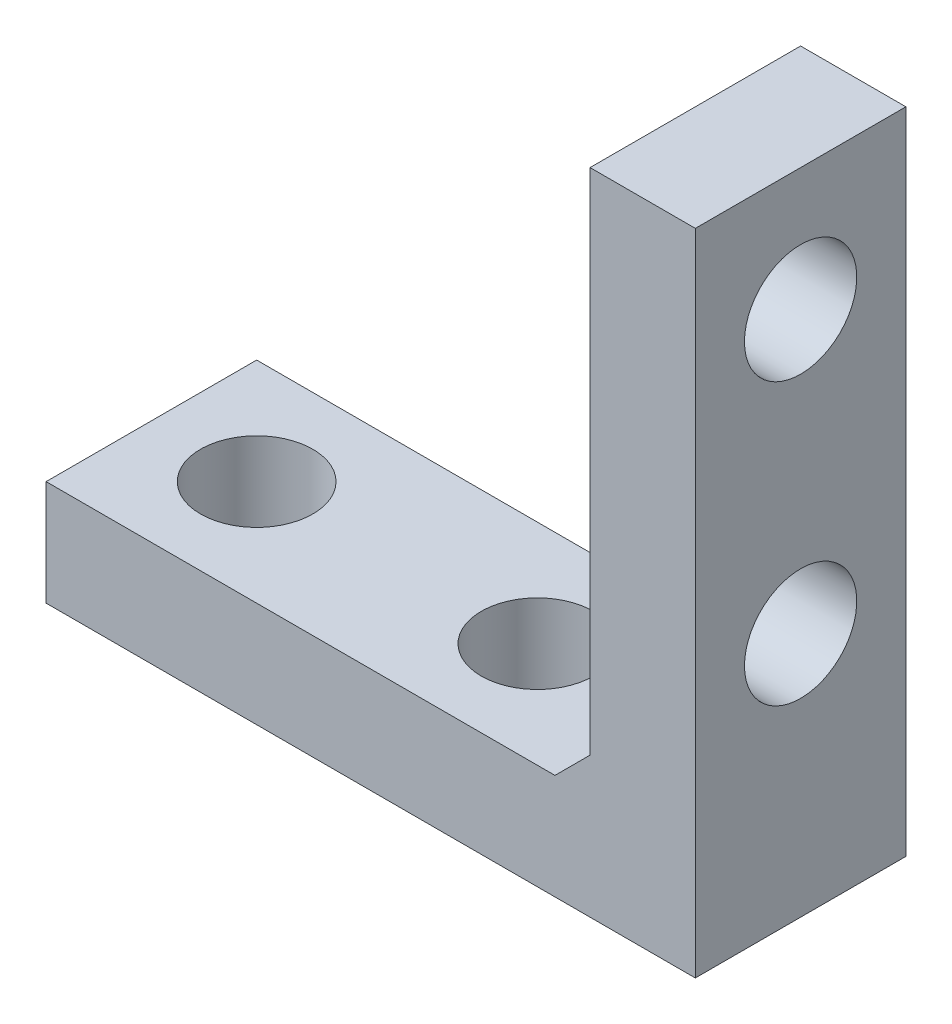
ISO-10303-21;
HEADER;
FILE_DESCRIPTION(('STEP AP214'),'2;1');
FILE_NAME('part.step','',(''),(''),'','','');
FILE_SCHEMA(('AUTOMOTIVE_DESIGN { 1 0 10303 214 1 1 1 1 }'));
ENDSEC;
DATA;
#1=APPLICATION_CONTEXT('core data for automotive mechanical design processes');
#2=APPLICATION_PROTOCOL_DEFINITION('international standard','automotive_design',2000,#1);
#3=PRODUCT_CONTEXT('',#1,'mechanical');
#4=PRODUCT('Part','Part','',(#3));
#5=PRODUCT_RELATED_PRODUCT_CATEGORY('part','',(#4));
#6=PRODUCT_DEFINITION_FORMATION('','',#4);
#7=PRODUCT_DEFINITION_CONTEXT('part definition',#1,'design');
#8=PRODUCT_DEFINITION('design','',#6,#7);
#9=PRODUCT_DEFINITION_SHAPE('','',#8);
#10=(LENGTH_UNIT() NAMED_UNIT(*) SI_UNIT(.MILLI.,.METRE.));
#11=(NAMED_UNIT(*) PLANE_ANGLE_UNIT() SI_UNIT($,.RADIAN.));
#12=(NAMED_UNIT(*) SI_UNIT($,.STERADIAN.) SOLID_ANGLE_UNIT());
#13=UNCERTAINTY_MEASURE_WITH_UNIT(LENGTH_MEASURE(1.E-05),#10,'distance_accuracy_value','');
#14=(GEOMETRIC_REPRESENTATION_CONTEXT(3) GLOBAL_UNCERTAINTY_ASSIGNED_CONTEXT((#13)) GLOBAL_UNIT_ASSIGNED_CONTEXT((#10,
#11,#12)) REPRESENTATION_CONTEXT('',''));
#15=CARTESIAN_POINT('',(0.,0.,0.));
#16=DIRECTION('',(0.,0.,1.));
#17=DIRECTION('',(1.,0.,0.));
#18=AXIS2_PLACEMENT_3D('',#15,#16,#17);
#19=CARTESIAN_POINT('',(0.,3.,0.));
#20=DIRECTION('',(0.,-1.,0.));
#21=DIRECTION('',(0.,0.,-1.));
#22=AXIS2_PLACEMENT_3D('',#19,#20,#21);
#23=PLANE('',#22);
#24=CARTESIAN_POINT('',(1.75,3.,0.));
#25=DIRECTION('',(0.,1.,0.));
#26=DIRECTION('',(0.,0.,1.));
#27=AXIS2_PLACEMENT_3D('',#24,#25,#26);
#28=CIRCLE('',#27,1.6);
#29=CARTESIAN_POINT('',(1.75,3.,1.6));
#30=VERTEX_POINT('',#29);
#31=EDGE_CURVE('E137',#30,#30,#28,.T.);
#32=ORIENTED_EDGE('',*,*,#31,.F.);
#33=EDGE_LOOP('',(#32));
#34=FACE_BOUND('',#33,.T.);
#35=CARTESIAN_POINT('',(-6.25,3.,0.));
#36=DIRECTION('',(0.,1.,0.));
#37=DIRECTION('',(0.,0.,1.));
#38=AXIS2_PLACEMENT_3D('',#35,#36,#37);
#39=CIRCLE('',#38,1.6);
#40=CARTESIAN_POINT('',(-6.25,3.,1.6));
#41=VERTEX_POINT('',#40);
#42=EDGE_CURVE('E99',#41,#41,#39,.T.);
#43=ORIENTED_EDGE('',*,*,#42,.F.);
#44=EDGE_LOOP('',(#43));
#45=FACE_BOUND('',#44,.T.);
#46=DIRECTION('',(1.,0.,0.));
#47=VECTOR('',#46,1.);
#48=CARTESIAN_POINT('',(-9.25,3.,3.));
#49=LINE('',#48,#47);
#50=CARTESIAN_POINT('',(-9.25,3.,3.));
#51=VERTEX_POINT('',#50);
#52=CARTESIAN_POINT('',(5.25,3.,3.));
#53=VERTEX_POINT('',#52);
#54=EDGE_CURVE('E94',#51,#53,#49,.T.);
#55=ORIENTED_EDGE('',*,*,#54,.T.);
#56=DIRECTION('',(0.,0.,1.));
#57=VECTOR('',#56,1.);
#58=CARTESIAN_POINT('',(5.25,3.,-3.));
#59=LINE('',#58,#57);
#60=CARTESIAN_POINT('',(5.25,3.,-3.));
#61=VERTEX_POINT('',#60);
#62=EDGE_CURVE('E147',#61,#53,#59,.T.);
#63=ORIENTED_EDGE('',*,*,#62,.F.);
#64=DIRECTION('',(-1.,0.,0.));
#65=VECTOR('',#64,1.);
#66=CARTESIAN_POINT('',(-9.25,3.,-3.));
#67=LINE('',#66,#65);
#68=CARTESIAN_POINT('',(-9.25,3.,-3.));
#69=VERTEX_POINT('',#68);
#70=EDGE_CURVE('E85',#61,#69,#67,.T.);
#71=ORIENTED_EDGE('',*,*,#70,.T.);
#72=DIRECTION('',(0.,0.,1.));
#73=VECTOR('',#72,1.);
#74=CARTESIAN_POINT('',(-9.25,3.,3.));
#75=LINE('',#74,#73);
#76=EDGE_CURVE('E52',#69,#51,#75,.T.);
#77=ORIENTED_EDGE('',*,*,#76,.T.);
#78=EDGE_LOOP('',(#55,#63,#71,#77));
#79=FACE_BOUND('',#78,.T.);
#80=ADVANCED_FACE('F35',(#34,#45,#79),#23,.F.);
#81=CARTESIAN_POINT('',(0.,0.,0.));
#82=DIRECTION('',(0.,-1.,0.));
#83=DIRECTION('',(0.,0.,-1.));
#84=AXIS2_PLACEMENT_3D('',#81,#82,#83);
#85=PLANE('',#84);
#86=CARTESIAN_POINT('',(-6.25,0.,0.));
#87=DIRECTION('',(0.,1.,0.));
#88=DIRECTION('',(0.,0.,1.));
#89=AXIS2_PLACEMENT_3D('',#86,#87,#88);
#90=CIRCLE('',#89,1.6);
#91=CARTESIAN_POINT('',(-6.25,0.,1.6));
#92=VERTEX_POINT('',#91);
#93=EDGE_CURVE('E103',#92,#92,#90,.T.);
#94=ORIENTED_EDGE('',*,*,#93,.T.);
#95=EDGE_LOOP('',(#94));
#96=FACE_BOUND('',#95,.T.);
#97=DIRECTION('',(0.,0.,-1.));
#98=VECTOR('',#97,1.);
#99=CARTESIAN_POINT('',(9.25,0.,3.));
#100=LINE('',#99,#98);
#101=CARTESIAN_POINT('',(9.25,0.,3.));
#102=VERTEX_POINT('',#101);
#103=CARTESIAN_POINT('',(9.25,0.,-3.));
#104=VERTEX_POINT('',#103);
#105=EDGE_CURVE('E91',#102,#104,#100,.T.);
#106=ORIENTED_EDGE('',*,*,#105,.F.);
#107=DIRECTION('',(1.,0.,0.));
#108=VECTOR('',#107,1.);
#109=CARTESIAN_POINT('',(-9.25,0.,3.));
#110=LINE('',#109,#108);
#111=CARTESIAN_POINT('',(-9.25,0.,3.));
#112=VERTEX_POINT('',#111);
#113=EDGE_CURVE('E74',#112,#102,#110,.T.);
#114=ORIENTED_EDGE('',*,*,#113,.F.);
#115=DIRECTION('',(0.,0.,1.));
#116=VECTOR('',#115,1.);
#117=CARTESIAN_POINT('',(-9.25,0.,3.));
#118=LINE('',#117,#116);
#119=CARTESIAN_POINT('',(-9.25,0.,-3.));
#120=VERTEX_POINT('',#119);
#121=EDGE_CURVE('E68',#120,#112,#118,.T.);
#122=ORIENTED_EDGE('',*,*,#121,.F.);
#123=DIRECTION('',(-1.,0.,0.));
#124=VECTOR('',#123,1.);
#125=CARTESIAN_POINT('',(-9.25,0.,-3.));
#126=LINE('',#125,#124);
#127=EDGE_CURVE('E98',#104,#120,#126,.T.);
#128=ORIENTED_EDGE('',*,*,#127,.F.);
#129=EDGE_LOOP('',(#106,#114,#122,#128));
#130=FACE_BOUND('',#129,.T.);
#131=CARTESIAN_POINT('',(1.75,0.,0.));
#132=DIRECTION('',(0.,1.,0.));
#133=DIRECTION('',(0.,0.,1.));
#134=AXIS2_PLACEMENT_3D('',#131,#132,#133);
#135=CIRCLE('',#134,1.6);
#136=CARTESIAN_POINT('',(1.75,0.,1.6));
#137=VERTEX_POINT('',#136);
#138=EDGE_CURVE('E136',#137,#137,#135,.T.);
#139=ORIENTED_EDGE('',*,*,#138,.T.);
#140=EDGE_LOOP('',(#139));
#141=FACE_BOUND('',#140,.T.);
#142=ADVANCED_FACE('F96',(#96,#130,#141),#85,.T.);
#143=CARTESIAN_POINT('',(9.25,3.,3.));
#144=DIRECTION('',(-1.,0.,0.));
#145=DIRECTION('',(0.,0.,1.));
#146=AXIS2_PLACEMENT_3D('',#143,#144,#145);
#147=PLANE('',#146);
#148=CARTESIAN_POINT('',(9.25,7.,0.));
#149=DIRECTION('',(-1.,0.,0.));
#150=DIRECTION('',(0.,0.,1.));
#151=AXIS2_PLACEMENT_3D('',#148,#149,#150);
#152=CIRCLE('',#151,1.6);
#153=CARTESIAN_POINT('',(9.25,7.,1.6));
#154=VERTEX_POINT('',#153);
#155=EDGE_CURVE('E167',#154,#154,#152,.T.);
#156=ORIENTED_EDGE('',*,*,#155,.T.);
#157=EDGE_LOOP('',(#156));
#158=FACE_BOUND('',#157,.T.);
#159=CARTESIAN_POINT('',(9.25,15.,0.));
#160=DIRECTION('',(-1.,0.,0.));
#161=DIRECTION('',(0.,0.,1.));
#162=AXIS2_PLACEMENT_3D('',#159,#160,#161);
#163=CIRCLE('',#162,1.6);
#164=CARTESIAN_POINT('',(9.25,15.,1.59999999999997));
#165=VERTEX_POINT('',#164);
#166=EDGE_CURVE('E173',#165,#165,#163,.T.);
#167=ORIENTED_EDGE('',*,*,#166,.T.);
#168=EDGE_LOOP('',(#167));
#169=FACE_BOUND('',#168,.T.);
#170=ORIENTED_EDGE('',*,*,#105,.T.);
#171=DIRECTION('',(0.,-1.,0.));
#172=VECTOR('',#171,1.);
#173=CARTESIAN_POINT('',(9.25,3.,-3.));
#174=LINE('',#173,#172);
#175=CARTESIAN_POINT('',(9.25,18.5,-3.));
#176=VERTEX_POINT('',#175);
#177=EDGE_CURVE('E11',#176,#104,#174,.T.);
#178=ORIENTED_EDGE('',*,*,#177,.F.);
#179=DIRECTION('',(0.,0.,-1.));
#180=VECTOR('',#179,1.);
#181=CARTESIAN_POINT('',(9.25,18.5,-3.));
#182=LINE('',#181,#180);
#183=CARTESIAN_POINT('',(9.25,18.5,3.));
#184=VERTEX_POINT('',#183);
#185=EDGE_CURVE('E93',#184,#176,#182,.T.);
#186=ORIENTED_EDGE('',*,*,#185,.F.);
#187=DIRECTION('',(0.,-1.,0.));
#188=VECTOR('',#187,1.);
#189=CARTESIAN_POINT('',(9.25,3.,3.));
#190=LINE('',#189,#188);
#191=EDGE_CURVE('E79',#184,#102,#190,.T.);
#192=ORIENTED_EDGE('',*,*,#191,.T.);
#193=EDGE_LOOP('',(#170,#178,#186,#192));
#194=FACE_BOUND('',#193,.T.);
#195=ADVANCED_FACE('F37',(#158,#169,#194),#147,.F.);
#196=CARTESIAN_POINT('',(-9.25,3.,-3.));
#197=DIRECTION('',(0.,0.,1.));
#198=DIRECTION('',(1.,0.,0.));
#199=AXIS2_PLACEMENT_3D('',#196,#197,#198);
#200=PLANE('',#199);
#201=ORIENTED_EDGE('',*,*,#70,.F.);
#202=DIRECTION('',(-0.707106781186547,-0.707106781186548,0.));
#203=VECTOR('',#202,1.);
#204=CARTESIAN_POINT('',(5.25,3.,-3.));
#205=LINE('',#204,#203);
#206=CARTESIAN_POINT('',(6.25,4.,-3.));
#207=VERTEX_POINT('',#206);
#208=EDGE_CURVE('E158',#207,#61,#205,.T.);
#209=ORIENTED_EDGE('',*,*,#208,.F.);
#210=DIRECTION('',(0.,-1.,0.));
#211=VECTOR('',#210,1.);
#212=CARTESIAN_POINT('',(6.25,18.5,-3.));
#213=LINE('',#212,#211);
#214=CARTESIAN_POINT('',(6.25,18.5,-3.));
#215=VERTEX_POINT('',#214);
#216=EDGE_CURVE('E128',#215,#207,#213,.T.);
#217=ORIENTED_EDGE('',*,*,#216,.F.);
#218=DIRECTION('',(-1.,0.,0.));
#219=VECTOR('',#218,1.);
#220=CARTESIAN_POINT('',(9.25,18.5,-3.));
#221=LINE('',#220,#219);
#222=EDGE_CURVE('E119',#176,#215,#221,.T.);
#223=ORIENTED_EDGE('',*,*,#222,.F.);
#224=ORIENTED_EDGE('',*,*,#177,.T.);
#225=ORIENTED_EDGE('',*,*,#127,.T.);
#226=DIRECTION('',(0.,-1.,0.));
#227=VECTOR('',#226,1.);
#228=CARTESIAN_POINT('',(-9.25,3.,-3.));
#229=LINE('',#228,#227);
#230=EDGE_CURVE('E44',#69,#120,#229,.T.);
#231=ORIENTED_EDGE('',*,*,#230,.F.);
#232=EDGE_LOOP('',(#201,#209,#217,#223,#224,#225,#231));
#233=FACE_BOUND('',#232,.T.);
#234=ADVANCED_FACE('F113',(#233),#200,.F.);
#235=CARTESIAN_POINT('',(-9.25,3.,3.));
#236=DIRECTION('',(1.,0.,0.));
#237=DIRECTION('',(0.,0.,-1.));
#238=AXIS2_PLACEMENT_3D('',#235,#236,#237);
#239=PLANE('',#238);
#240=ORIENTED_EDGE('',*,*,#121,.T.);
#241=DIRECTION('',(0.,-1.,0.));
#242=VECTOR('',#241,1.);
#243=CARTESIAN_POINT('',(-9.25,3.,3.));
#244=LINE('',#243,#242);
#245=EDGE_CURVE('E82',#51,#112,#244,.T.);
#246=ORIENTED_EDGE('',*,*,#245,.F.);
#247=ORIENTED_EDGE('',*,*,#76,.F.);
#248=ORIENTED_EDGE('',*,*,#230,.T.);
#249=EDGE_LOOP('',(#240,#246,#247,#248));
#250=FACE_BOUND('',#249,.T.);
#251=ADVANCED_FACE('F110',(#250),#239,.F.);
#252=CARTESIAN_POINT('',(-9.25,3.,3.));
#253=DIRECTION('',(0.,0.,-1.));
#254=DIRECTION('',(-1.,0.,0.));
#255=AXIS2_PLACEMENT_3D('',#252,#253,#254);
#256=PLANE('',#255);
#257=ORIENTED_EDGE('',*,*,#113,.T.);
#258=ORIENTED_EDGE('',*,*,#191,.F.);
#259=DIRECTION('',(1.,0.,0.));
#260=VECTOR('',#259,1.);
#261=CARTESIAN_POINT('',(9.25,18.5,3.));
#262=LINE('',#261,#260);
#263=CARTESIAN_POINT('',(6.25,18.5,3.));
#264=VERTEX_POINT('',#263);
#265=EDGE_CURVE('E124',#264,#184,#262,.T.);
#266=ORIENTED_EDGE('',*,*,#265,.F.);
#267=DIRECTION('',(0.,-1.,0.));
#268=VECTOR('',#267,1.);
#269=CARTESIAN_POINT('',(6.25,18.5,3.));
#270=LINE('',#269,#268);
#271=CARTESIAN_POINT('',(6.25,4.,3.));
#272=VERTEX_POINT('',#271);
#273=EDGE_CURVE('E125',#264,#272,#270,.T.);
#274=ORIENTED_EDGE('',*,*,#273,.T.);
#275=DIRECTION('',(-0.707106781186547,-0.707106781186548,0.));
#276=VECTOR('',#275,1.);
#277=CARTESIAN_POINT('',(5.25,3.,3.));
#278=LINE('',#277,#276);
#279=EDGE_CURVE('E153',#272,#53,#278,.T.);
#280=ORIENTED_EDGE('',*,*,#279,.T.);
#281=ORIENTED_EDGE('',*,*,#54,.F.);
#282=ORIENTED_EDGE('',*,*,#245,.T.);
#283=EDGE_LOOP('',(#257,#258,#266,#274,#280,#281,#282));
#284=FACE_BOUND('',#283,.T.);
#285=ADVANCED_FACE('F76',(#284),#256,.F.);
#286=CARTESIAN_POINT('',(-6.25,3.,0.));
#287=DIRECTION('',(0.,-1.,0.));
#288=DIRECTION('',(0.,0.,-1.));
#289=AXIS2_PLACEMENT_3D('',#286,#287,#288);
#290=CYLINDRICAL_SURFACE('',#289,1.6);
#291=ORIENTED_EDGE('',*,*,#42,.T.);
#292=EDGE_LOOP('',(#291));
#293=FACE_BOUND('',#292,.T.);
#294=ORIENTED_EDGE('',*,*,#93,.F.);
#295=EDGE_LOOP('',(#294));
#296=FACE_BOUND('',#295,.T.);
#297=ADVANCED_FACE('F209',(#293,#296),#290,.F.);
#298=CARTESIAN_POINT('',(1.75,3.,0.));
#299=DIRECTION('',(0.,-1.,0.));
#300=DIRECTION('',(0.,0.,-1.));
#301=AXIS2_PLACEMENT_3D('',#298,#299,#300);
#302=CYLINDRICAL_SURFACE('',#301,1.6);
#303=ORIENTED_EDGE('',*,*,#31,.T.);
#304=EDGE_LOOP('',(#303));
#305=FACE_BOUND('',#304,.T.);
#306=ORIENTED_EDGE('',*,*,#138,.F.);
#307=EDGE_LOOP('',(#306));
#308=FACE_BOUND('',#307,.T.);
#309=ADVANCED_FACE('F232',(#305,#308),#302,.F.);
#310=CARTESIAN_POINT('',(6.25,18.5,-3.));
#311=DIRECTION('',(1.,0.,0.));
#312=DIRECTION('',(0.,0.,-1.));
#313=AXIS2_PLACEMENT_3D('',#310,#311,#312);
#314=PLANE('',#313);
#315=CARTESIAN_POINT('',(6.25,7.,0.));
#316=DIRECTION('',(-1.,0.,0.));
#317=DIRECTION('',(0.,0.,1.));
#318=AXIS2_PLACEMENT_3D('',#315,#316,#317);
#319=CIRCLE('',#318,1.6);
#320=CARTESIAN_POINT('',(6.25,7.,1.6));
#321=VERTEX_POINT('',#320);
#322=EDGE_CURVE('E170',#321,#321,#319,.T.);
#323=ORIENTED_EDGE('',*,*,#322,.F.);
#324=EDGE_LOOP('',(#323));
#325=FACE_BOUND('',#324,.T.);
#326=CARTESIAN_POINT('',(6.25,15.,0.));
#327=DIRECTION('',(-1.,0.,0.));
#328=DIRECTION('',(0.,0.,1.));
#329=AXIS2_PLACEMENT_3D('',#326,#327,#328);
#330=CIRCLE('',#329,1.6);
#331=CARTESIAN_POINT('',(6.25,15.,1.59999999999997));
#332=VERTEX_POINT('',#331);
#333=EDGE_CURVE('E165',#332,#332,#330,.T.);
#334=ORIENTED_EDGE('',*,*,#333,.F.);
#335=EDGE_LOOP('',(#334));
#336=FACE_BOUND('',#335,.T.);
#337=ORIENTED_EDGE('',*,*,#216,.T.);
#338=DIRECTION('',(0.,0.,1.));
#339=VECTOR('',#338,1.);
#340=CARTESIAN_POINT('',(6.25,4.,-3.));
#341=LINE('',#340,#339);
#342=EDGE_CURVE('E161',#207,#272,#341,.T.);
#343=ORIENTED_EDGE('',*,*,#342,.T.);
#344=ORIENTED_EDGE('',*,*,#273,.F.);
#345=DIRECTION('',(0.,0.,1.));
#346=VECTOR('',#345,1.);
#347=CARTESIAN_POINT('',(6.25,18.5,-3.));
#348=LINE('',#347,#346);
#349=EDGE_CURVE('E130',#215,#264,#348,.T.);
#350=ORIENTED_EDGE('',*,*,#349,.F.);
#351=EDGE_LOOP('',(#337,#343,#344,#350));
#352=FACE_BOUND('',#351,.T.);
#353=ADVANCED_FACE('F182',(#325,#336,#352),#314,.F.);
#354=CARTESIAN_POINT('',(0.,18.5,0.));
#355=DIRECTION('',(0.,1.,0.));
#356=DIRECTION('',(0.,0.,1.));
#357=AXIS2_PLACEMENT_3D('',#354,#355,#356);
#358=PLANE('',#357);
#359=ORIENTED_EDGE('',*,*,#222,.T.);
#360=ORIENTED_EDGE('',*,*,#349,.T.);
#361=ORIENTED_EDGE('',*,*,#265,.T.);
#362=ORIENTED_EDGE('',*,*,#185,.T.);
#363=EDGE_LOOP('',(#359,#360,#361,#362));
#364=FACE_BOUND('',#363,.T.);
#365=ADVANCED_FACE('F121',(#364),#358,.T.);
#366=CARTESIAN_POINT('',(9.25,15.,0.));
#367=DIRECTION('',(-1.,0.,0.));
#368=DIRECTION('',(0.,0.,1.));
#369=AXIS2_PLACEMENT_3D('',#366,#367,#368);
#370=CYLINDRICAL_SURFACE('',#369,1.6);
#371=ORIENTED_EDGE('',*,*,#166,.F.);
#372=EDGE_LOOP('',(#371));
#373=FACE_BOUND('',#372,.T.);
#374=ORIENTED_EDGE('',*,*,#333,.T.);
#375=EDGE_LOOP('',(#374));
#376=FACE_BOUND('',#375,.T.);
#377=ADVANCED_FACE('F195',(#373,#376),#370,.F.);
#378=CARTESIAN_POINT('',(9.25,7.,0.));
#379=DIRECTION('',(-1.,0.,0.));
#380=DIRECTION('',(0.,0.,1.));
#381=AXIS2_PLACEMENT_3D('',#378,#379,#380);
#382=CYLINDRICAL_SURFACE('',#381,1.6);
#383=ORIENTED_EDGE('',*,*,#155,.F.);
#384=EDGE_LOOP('',(#383));
#385=FACE_BOUND('',#384,.T.);
#386=ORIENTED_EDGE('',*,*,#322,.T.);
#387=EDGE_LOOP('',(#386));
#388=FACE_BOUND('',#387,.T.);
#389=ADVANCED_FACE('F190',(#385,#388),#382,.F.);
#390=CARTESIAN_POINT('',(5.25,3.,-3.));
#391=DIRECTION('',(-0.707106781186548,0.707106781186547,0.));
#392=DIRECTION('',(-0.707106781186547,-0.707106781186548,0.));
#393=AXIS2_PLACEMENT_3D('',#390,#391,#392);
#394=PLANE('',#393);
#395=ORIENTED_EDGE('',*,*,#279,.F.);
#396=ORIENTED_EDGE('',*,*,#342,.F.);
#397=ORIENTED_EDGE('',*,*,#208,.T.);
#398=ORIENTED_EDGE('',*,*,#62,.T.);
#399=EDGE_LOOP('',(#395,#396,#397,#398));
#400=FACE_BOUND('',#399,.T.);
#401=ADVANCED_FACE('F184',(#400),#394,.T.);
#402=CLOSED_SHELL('',(#80,#142,#195,#234,#251,#285,#297,#309,#353,#365,#377,#389,#401));
#403=MANIFOLD_SOLID_BREP('B2',#402);
#404=ADVANCED_BREP_SHAPE_REPRESENTATION('',(#18,#403),#14);
#405=SHAPE_DEFINITION_REPRESENTATION(#9,#404);
ENDSEC;
END-ISO-10303-21;
